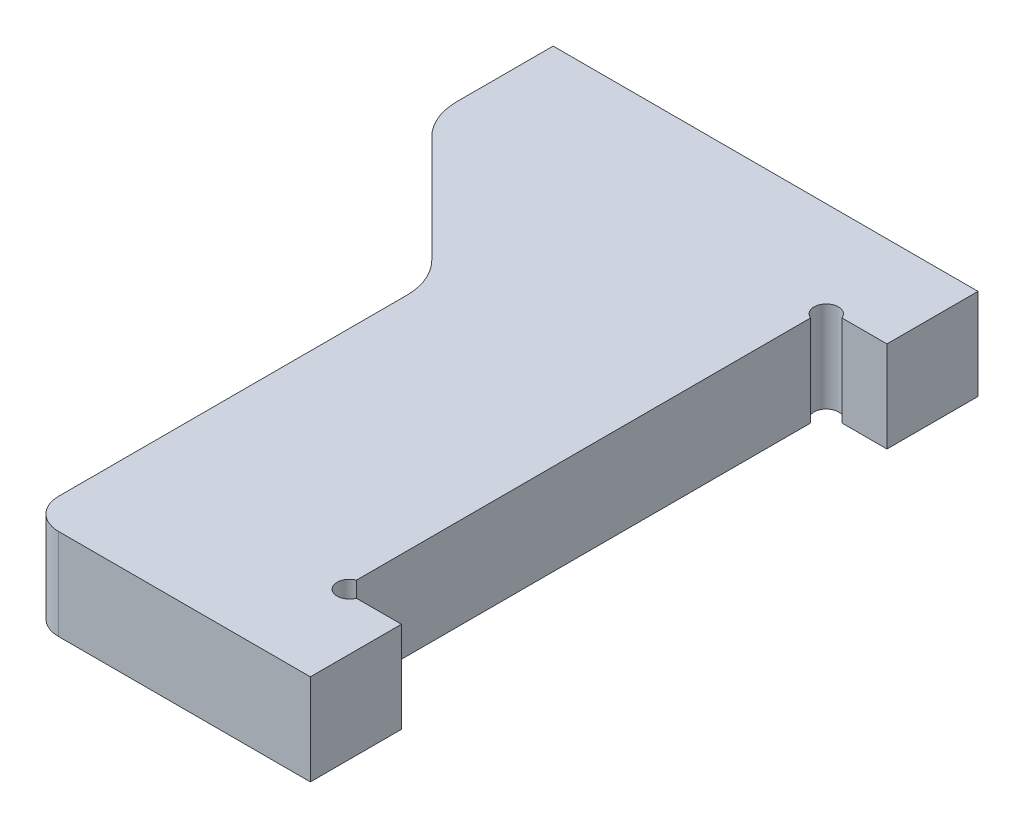
ISO-10303-21;
HEADER;
FILE_DESCRIPTION(('STEP AP214'),'2;1');
FILE_NAME('part.step','',(''),(''),'','','');
FILE_SCHEMA(('AUTOMOTIVE_DESIGN { 1 0 10303 214 1 1 1 1 }'));
ENDSEC;
DATA;
#1=APPLICATION_CONTEXT('core data for automotive mechanical design processes');
#2=APPLICATION_PROTOCOL_DEFINITION('international standard','automotive_design',2000,#1);
#3=PRODUCT_CONTEXT('',#1,'mechanical');
#4=PRODUCT('Part','Part','',(#3));
#5=PRODUCT_RELATED_PRODUCT_CATEGORY('part','',(#4));
#6=PRODUCT_DEFINITION_FORMATION('','',#4);
#7=PRODUCT_DEFINITION_CONTEXT('part definition',#1,'design');
#8=PRODUCT_DEFINITION('design','',#6,#7);
#9=PRODUCT_DEFINITION_SHAPE('','',#8);
#10=(LENGTH_UNIT() NAMED_UNIT(*) SI_UNIT(.MILLI.,.METRE.));
#11=(NAMED_UNIT(*) PLANE_ANGLE_UNIT() SI_UNIT($,.RADIAN.));
#12=(NAMED_UNIT(*) SI_UNIT($,.STERADIAN.) SOLID_ANGLE_UNIT());
#13=UNCERTAINTY_MEASURE_WITH_UNIT(LENGTH_MEASURE(1.E-05),#10,'distance_accuracy_value','');
#14=(GEOMETRIC_REPRESENTATION_CONTEXT(3) GLOBAL_UNCERTAINTY_ASSIGNED_CONTEXT((#13)) GLOBAL_UNIT_ASSIGNED_CONTEXT((#10,
#11,#12)) REPRESENTATION_CONTEXT('',''));
#15=CARTESIAN_POINT('',(0.,0.,0.));
#16=DIRECTION('',(0.,0.,1.));
#17=DIRECTION('',(1.,0.,0.));
#18=AXIS2_PLACEMENT_3D('',#15,#16,#17);
#19=CARTESIAN_POINT('',(18.25,15.,55.));
#20=DIRECTION('',(-1.,0.,0.));
#21=DIRECTION('',(0.,0.,1.));
#22=AXIS2_PLACEMENT_3D('',#19,#20,#21);
#23=PLANE('',#22);
#24=DIRECTION('',(0.,0.,-1.));
#25=VECTOR('',#24,1.);
#26=CARTESIAN_POINT('',(18.25,0.,55.));
#27=LINE('',#26,#25);
#28=CARTESIAN_POINT('',(18.25,0.,37.4220645254265));
#29=VERTEX_POINT('',#28);
#30=CARTESIAN_POINT('',(18.25,0.,-37.4220645254265));
#31=VERTEX_POINT('',#30);
#32=EDGE_CURVE('E236',#29,#31,#27,.T.);
#33=ORIENTED_EDGE('',*,*,#32,.T.);
#34=DIRECTION('',(0.,1.,0.));
#35=VECTOR('',#34,1.);
#36=CARTESIAN_POINT('',(18.25,0.,-37.4220645254265));
#37=LINE('',#36,#35);
#38=CARTESIAN_POINT('',(18.25,15.,-37.4220645254265));
#39=VERTEX_POINT('',#38);
#40=EDGE_CURVE('E181',#31,#39,#37,.T.);
#41=ORIENTED_EDGE('',*,*,#40,.T.);
#42=DIRECTION('',(0.,0.,-1.));
#43=VECTOR('',#42,1.);
#44=CARTESIAN_POINT('',(18.25,15.,55.));
#45=LINE('',#44,#43);
#46=CARTESIAN_POINT('',(18.25,15.,37.4220645254265));
#47=VERTEX_POINT('',#46);
#48=EDGE_CURVE('E165',#47,#39,#45,.T.);
#49=ORIENTED_EDGE('',*,*,#48,.F.);
#50=DIRECTION('',(0.,1.,0.));
#51=VECTOR('',#50,1.);
#52=CARTESIAN_POINT('',(18.25,0.,37.4220645254265));
#53=LINE('',#52,#51);
#54=EDGE_CURVE('E174',#47,#29,#53,.F.);
#55=ORIENTED_EDGE('',*,*,#54,.T.);
#56=EDGE_LOOP('',(#33,#41,#49,#55));
#57=FACE_BOUND('',#56,.T.);
#58=ADVANCED_FACE('F45',(#57),#23,.F.);
#59=CARTESIAN_POINT('',(-18.25,15.,55.));
#60=DIRECTION('',(1.,0.,0.));
#61=DIRECTION('',(0.,0.,-1.));
#62=AXIS2_PLACEMENT_3D('',#59,#60,#61);
#63=PLANE('',#62);
#64=DIRECTION('',(0.,0.,1.));
#65=VECTOR('',#64,1.);
#66=CARTESIAN_POINT('',(-18.25,0.,55.));
#67=LINE('',#66,#65);
#68=CARTESIAN_POINT('',(-18.25,0.,-7.35786437626913));
#69=VERTEX_POINT('',#68);
#70=CARTESIAN_POINT('',(-18.25,0.,50.));
#71=VERTEX_POINT('',#70);
#72=EDGE_CURVE('E257',#69,#71,#67,.T.);
#73=ORIENTED_EDGE('',*,*,#72,.T.);
#74=DIRECTION('',(0.,-1.,0.));
#75=VECTOR('',#74,1.);
#76=CARTESIAN_POINT('',(-18.25,15.,50.));
#77=LINE('',#76,#75);
#78=CARTESIAN_POINT('',(-18.25,15.,50.));
#79=VERTEX_POINT('',#78);
#80=EDGE_CURVE('E295',#71,#79,#77,.F.);
#81=ORIENTED_EDGE('',*,*,#80,.T.);
#82=DIRECTION('',(0.,0.,1.));
#83=VECTOR('',#82,1.);
#84=CARTESIAN_POINT('',(-18.25,15.,55.));
#85=LINE('',#84,#83);
#86=CARTESIAN_POINT('',(-18.25,15.,-7.35786437626913));
#87=VERTEX_POINT('',#86);
#88=EDGE_CURVE('E243',#87,#79,#85,.T.);
#89=ORIENTED_EDGE('',*,*,#88,.F.);
#90=DIRECTION('',(0.,1.,0.));
#91=VECTOR('',#90,1.);
#92=CARTESIAN_POINT('',(-18.25,15.,-7.35786437626913));
#93=LINE('',#92,#91);
#94=EDGE_CURVE('E279',#87,#69,#93,.F.);
#95=ORIENTED_EDGE('',*,*,#94,.T.);
#96=EDGE_LOOP('',(#73,#81,#89,#95));
#97=FACE_BOUND('',#96,.T.);
#98=ADVANCED_FACE('F316',(#97),#63,.F.);
#99=CARTESIAN_POINT('',(-18.25,15.,-55.));
#100=DIRECTION('',(0.,0.,1.));
#101=DIRECTION('',(1.,0.,0.));
#102=AXIS2_PLACEMENT_3D('',#99,#100,#101);
#103=PLANE('',#102);
#104=DIRECTION('',(-1.,0.,0.));
#105=VECTOR('',#104,1.);
#106=CARTESIAN_POINT('',(-18.25,0.,-55.));
#107=LINE('',#106,#105);
#108=CARTESIAN_POINT('',(28.25,0.,-55.));
#109=VERTEX_POINT('',#108);
#110=CARTESIAN_POINT('',(-41.75,0.,-55.));
#111=VERTEX_POINT('',#110);
#112=EDGE_CURVE('E254',#109,#111,#107,.T.);
#113=ORIENTED_EDGE('',*,*,#112,.T.);
#114=DIRECTION('',(0.,1.,0.));
#115=VECTOR('',#114,1.);
#116=CARTESIAN_POINT('',(-41.75,0.,-55.));
#117=LINE('',#116,#115);
#118=CARTESIAN_POINT('',(-41.75,15.,-55.));
#119=VERTEX_POINT('',#118);
#120=EDGE_CURVE('E226',#111,#119,#117,.T.);
#121=ORIENTED_EDGE('',*,*,#120,.T.);
#122=DIRECTION('',(-1.,0.,0.));
#123=VECTOR('',#122,1.);
#124=CARTESIAN_POINT('',(-18.25,15.,-55.));
#125=LINE('',#124,#123);
#126=CARTESIAN_POINT('',(28.25,15.,-55.));
#127=VERTEX_POINT('',#126);
#128=EDGE_CURVE('E239',#127,#119,#125,.T.);
#129=ORIENTED_EDGE('',*,*,#128,.F.);
#130=DIRECTION('',(0.,1.,0.));
#131=VECTOR('',#130,1.);
#132=CARTESIAN_POINT('',(28.25,0.,-55.));
#133=LINE('',#132,#131);
#134=EDGE_CURVE('E187',#109,#127,#133,.T.);
#135=ORIENTED_EDGE('',*,*,#134,.F.);
#136=EDGE_LOOP('',(#113,#121,#129,#135));
#137=FACE_BOUND('',#136,.T.);
#138=ADVANCED_FACE('F336',(#137),#103,.F.);
#139=CARTESIAN_POINT('',(-18.25,15.,55.));
#140=DIRECTION('',(0.,0.,-1.));
#141=DIRECTION('',(-1.,0.,0.));
#142=AXIS2_PLACEMENT_3D('',#139,#140,#141);
#143=PLANE('',#142);
#144=DIRECTION('',(1.,0.,0.));
#145=VECTOR('',#144,1.);
#146=CARTESIAN_POINT('',(-18.25,15.,55.));
#147=LINE('',#146,#145);
#148=CARTESIAN_POINT('',(-13.25,15.,55.));
#149=VERTEX_POINT('',#148);
#150=CARTESIAN_POINT('',(28.25,15.,55.));
#151=VERTEX_POINT('',#150);
#152=EDGE_CURVE('E247',#149,#151,#147,.T.);
#153=ORIENTED_EDGE('',*,*,#152,.F.);
#154=DIRECTION('',(0.,-1.,0.));
#155=VECTOR('',#154,1.);
#156=CARTESIAN_POINT('',(-13.25,15.,55.));
#157=LINE('',#156,#155);
#158=CARTESIAN_POINT('',(-13.25,0.,55.));
#159=VERTEX_POINT('',#158);
#160=EDGE_CURVE('E288',#149,#159,#157,.T.);
#161=ORIENTED_EDGE('',*,*,#160,.T.);
#162=DIRECTION('',(1.,0.,0.));
#163=VECTOR('',#162,1.);
#164=CARTESIAN_POINT('',(-18.25,0.,55.));
#165=LINE('',#164,#163);
#166=CARTESIAN_POINT('',(28.25,0.,55.));
#167=VERTEX_POINT('',#166);
#168=EDGE_CURVE('E240',#159,#167,#165,.T.);
#169=ORIENTED_EDGE('',*,*,#168,.T.);
#170=DIRECTION('',(0.,1.,0.));
#171=VECTOR('',#170,1.);
#172=CARTESIAN_POINT('',(28.25,0.,55.));
#173=LINE('',#172,#171);
#174=EDGE_CURVE('E203',#167,#151,#173,.T.);
#175=ORIENTED_EDGE('',*,*,#174,.T.);
#176=EDGE_LOOP('',(#153,#161,#169,#175));
#177=FACE_BOUND('',#176,.T.);
#178=ADVANCED_FACE('F306',(#177),#143,.F.);
#179=CARTESIAN_POINT('',(0.,15.,0.));
#180=DIRECTION('',(0.,-1.,0.));
#181=DIRECTION('',(0.,0.,-1.));
#182=AXIS2_PLACEMENT_3D('',#179,#180,#181);
#183=PLANE('',#182);
#184=ORIENTED_EDGE('',*,*,#48,.T.);
#185=CARTESIAN_POINT('',(18.9571067811865,15.,-39.2928932188134));
#186=DIRECTION('',(0.,1.,0.));
#187=DIRECTION('',(0.,0.,1.));
#188=AXIS2_PLACEMENT_3D('',#185,#186,#187);
#189=CIRCLE('',#188,2.00000000000002);
#190=CARTESIAN_POINT('',(20.8279354745735,15.,-40.));
#191=VERTEX_POINT('',#190);
#192=EDGE_CURVE('E151',#191,#39,#189,.T.);
#193=ORIENTED_EDGE('',*,*,#192,.F.);
#194=DIRECTION('',(1.,0.,0.));
#195=VECTOR('',#194,1.);
#196=CARTESIAN_POINT('',(18.25,15.,-40.));
#197=LINE('',#196,#195);
#198=CARTESIAN_POINT('',(28.25,15.,-40.));
#199=VERTEX_POINT('',#198);
#200=EDGE_CURVE('E162',#191,#199,#197,.T.);
#201=ORIENTED_EDGE('',*,*,#200,.T.);
#202=DIRECTION('',(0.,0.,-1.));
#203=VECTOR('',#202,1.);
#204=CARTESIAN_POINT('',(28.25,15.,-55.));
#205=LINE('',#204,#203);
#206=EDGE_CURVE('E173',#199,#127,#205,.T.);
#207=ORIENTED_EDGE('',*,*,#206,.T.);
#208=ORIENTED_EDGE('',*,*,#128,.T.);
#209=DIRECTION('',(0.,0.,1.));
#210=VECTOR('',#209,1.);
#211=CARTESIAN_POINT('',(-41.75,15.,-35.));
#212=LINE('',#211,#210);
#213=CARTESIAN_POINT('',(-41.75,15.,-39.142135623731));
#214=VERTEX_POINT('',#213);
#215=EDGE_CURVE('E213',#119,#214,#212,.T.);
#216=ORIENTED_EDGE('',*,*,#215,.T.);
#217=CARTESIAN_POINT('',(-31.75,15.,-39.142135623731));
#218=DIRECTION('',(0.,-1.,0.));
#219=DIRECTION('',(0.,0.,-1.));
#220=AXIS2_PLACEMENT_3D('',#217,#218,#219);
#221=CIRCLE('',#220,10.);
#222=CARTESIAN_POINT('',(-38.8210678118655,15.,-32.0710678118655));
#223=VERTEX_POINT('',#222);
#224=EDGE_CURVE('E266',#214,#223,#221,.F.);
#225=ORIENTED_EDGE('',*,*,#224,.T.);
#226=DIRECTION('',(0.707106781186549,0.,0.707106781186546));
#227=VECTOR('',#226,1.);
#228=CARTESIAN_POINT('',(-18.25,15.,-11.5000000000001));
#229=LINE('',#228,#227);
#230=CARTESIAN_POINT('',(-21.1789321881345,15.,-14.4289321881346));
#231=VERTEX_POINT('',#230);
#232=EDGE_CURVE('E222',#223,#231,#229,.T.);
#233=ORIENTED_EDGE('',*,*,#232,.T.);
#234=CARTESIAN_POINT('',(-28.25,15.,-7.35786437626914));
#235=DIRECTION('',(0.,-1.,0.));
#236=DIRECTION('',(0.,0.,-1.));
#237=AXIS2_PLACEMENT_3D('',#234,#235,#236);
#238=CIRCLE('',#237,10.);
#239=EDGE_CURVE('E282',#231,#87,#238,.T.);
#240=ORIENTED_EDGE('',*,*,#239,.T.);
#241=ORIENTED_EDGE('',*,*,#88,.T.);
#242=CARTESIAN_POINT('',(-13.25,15.,50.));
#243=DIRECTION('',(0.,-1.,0.));
#244=DIRECTION('',(0.,0.,-1.));
#245=AXIS2_PLACEMENT_3D('',#242,#243,#244);
#246=CIRCLE('',#245,5.);
#247=EDGE_CURVE('E157',#79,#149,#246,.F.);
#248=ORIENTED_EDGE('',*,*,#247,.T.);
#249=ORIENTED_EDGE('',*,*,#152,.T.);
#250=DIRECTION('',(0.,0.,-1.));
#251=VECTOR('',#250,1.);
#252=CARTESIAN_POINT('',(28.25,15.,55.));
#253=LINE('',#252,#251);
#254=CARTESIAN_POINT('',(28.25,15.,40.));
#255=VERTEX_POINT('',#254);
#256=EDGE_CURVE('E191',#151,#255,#253,.T.);
#257=ORIENTED_EDGE('',*,*,#256,.T.);
#258=DIRECTION('',(-1.,0.,0.));
#259=VECTOR('',#258,1.);
#260=CARTESIAN_POINT('',(18.25,15.,40.));
#261=LINE('',#260,#259);
#262=CARTESIAN_POINT('',(20.8279354745735,15.,40.));
#263=VERTEX_POINT('',#262);
#264=EDGE_CURVE('E199',#255,#263,#261,.T.);
#265=ORIENTED_EDGE('',*,*,#264,.T.);
#266=CARTESIAN_POINT('',(18.9571067811865,15.,39.2928932188134));
#267=DIRECTION('',(0.,1.,0.));
#268=DIRECTION('',(0.,0.,-1.));
#269=AXIS2_PLACEMENT_3D('',#266,#267,#268);
#270=CIRCLE('',#269,2.00000000000002);
#271=EDGE_CURVE('E60',#47,#263,#270,.T.);
#272=ORIENTED_EDGE('',*,*,#271,.F.);
#273=EDGE_LOOP('',(#184,#193,#201,#207,#208,#216,#225,#233,#240,#241,#248,#249,#257,#265,#272));
#274=FACE_BOUND('',#273,.T.);
#275=ADVANCED_FACE('F160',(#274),#183,.F.);
#276=CARTESIAN_POINT('',(0.,0.,0.));
#277=DIRECTION('',(0.,-1.,0.));
#278=DIRECTION('',(0.,0.,-1.));
#279=AXIS2_PLACEMENT_3D('',#276,#277,#278);
#280=PLANE('',#279);
#281=CARTESIAN_POINT('',(18.9571067811865,0.,-39.2928932188134));
#282=DIRECTION('',(0.,1.,0.));
#283=DIRECTION('',(0.,0.,1.));
#284=AXIS2_PLACEMENT_3D('',#281,#282,#283);
#285=CIRCLE('',#284,2.00000000000002);
#286=CARTESIAN_POINT('',(20.8279354745735,0.,-40.));
#287=VERTEX_POINT('',#286);
#288=EDGE_CURVE('E68',#287,#31,#285,.T.);
#289=ORIENTED_EDGE('',*,*,#288,.T.);
#290=ORIENTED_EDGE('',*,*,#32,.F.);
#291=CARTESIAN_POINT('',(18.9571067811865,0.,39.2928932188134));
#292=DIRECTION('',(0.,1.,0.));
#293=DIRECTION('',(0.,0.,-1.));
#294=AXIS2_PLACEMENT_3D('',#291,#292,#293);
#295=CIRCLE('',#294,2.00000000000002);
#296=CARTESIAN_POINT('',(20.8279354745735,0.,40.));
#297=VERTEX_POINT('',#296);
#298=EDGE_CURVE('E346',#29,#297,#295,.T.);
#299=ORIENTED_EDGE('',*,*,#298,.T.);
#300=DIRECTION('',(-1.,0.,0.));
#301=VECTOR('',#300,1.);
#302=CARTESIAN_POINT('',(18.25,0.,40.));
#303=LINE('',#302,#301);
#304=CARTESIAN_POINT('',(28.25,0.,40.));
#305=VERTEX_POINT('',#304);
#306=EDGE_CURVE('E198',#305,#297,#303,.T.);
#307=ORIENTED_EDGE('',*,*,#306,.F.);
#308=DIRECTION('',(0.,0.,-1.));
#309=VECTOR('',#308,1.);
#310=CARTESIAN_POINT('',(28.25,0.,55.));
#311=LINE('',#310,#309);
#312=EDGE_CURVE('E194',#167,#305,#311,.T.);
#313=ORIENTED_EDGE('',*,*,#312,.F.);
#314=ORIENTED_EDGE('',*,*,#168,.F.);
#315=CARTESIAN_POINT('',(-13.25,0.,50.));
#316=DIRECTION('',(0.,-1.,0.));
#317=DIRECTION('',(0.,0.,-1.));
#318=AXIS2_PLACEMENT_3D('',#315,#316,#317);
#319=CIRCLE('',#318,5.);
#320=EDGE_CURVE('E292',#159,#71,#319,.T.);
#321=ORIENTED_EDGE('',*,*,#320,.T.);
#322=ORIENTED_EDGE('',*,*,#72,.F.);
#323=CARTESIAN_POINT('',(-28.25,0.,-7.35786437626914));
#324=DIRECTION('',(0.,-1.,0.));
#325=DIRECTION('',(0.,0.,-1.));
#326=AXIS2_PLACEMENT_3D('',#323,#324,#325);
#327=CIRCLE('',#326,10.);
#328=CARTESIAN_POINT('',(-21.1789321881345,0.,-14.4289321881346));
#329=VERTEX_POINT('',#328);
#330=EDGE_CURVE('E285',#69,#329,#327,.F.);
#331=ORIENTED_EDGE('',*,*,#330,.T.);
#332=DIRECTION('',(0.707106781186549,0.,0.707106781186546));
#333=VECTOR('',#332,1.);
#334=CARTESIAN_POINT('',(-18.25,0.,-11.5000000000001));
#335=LINE('',#334,#333);
#336=CARTESIAN_POINT('',(-38.8210678118655,0.,-32.0710678118655));
#337=VERTEX_POINT('',#336);
#338=EDGE_CURVE('E221',#337,#329,#335,.T.);
#339=ORIENTED_EDGE('',*,*,#338,.F.);
#340=CARTESIAN_POINT('',(-31.75,0.,-39.142135623731));
#341=DIRECTION('',(0.,-1.,0.));
#342=DIRECTION('',(0.,0.,-1.));
#343=AXIS2_PLACEMENT_3D('',#340,#341,#342);
#344=CIRCLE('',#343,10.);
#345=CARTESIAN_POINT('',(-41.75,0.,-39.142135623731));
#346=VERTEX_POINT('',#345);
#347=EDGE_CURVE('E276',#337,#346,#344,.T.);
#348=ORIENTED_EDGE('',*,*,#347,.T.);
#349=DIRECTION('',(0.,0.,1.));
#350=VECTOR('',#349,1.);
#351=CARTESIAN_POINT('',(-41.75,0.,-35.));
#352=LINE('',#351,#350);
#353=EDGE_CURVE('E217',#111,#346,#352,.T.);
#354=ORIENTED_EDGE('',*,*,#353,.F.);
#355=ORIENTED_EDGE('',*,*,#112,.F.);
#356=DIRECTION('',(0.,0.,-1.));
#357=VECTOR('',#356,1.);
#358=CARTESIAN_POINT('',(28.25,0.,-55.));
#359=LINE('',#358,#357);
#360=CARTESIAN_POINT('',(28.25,0.,-40.));
#361=VERTEX_POINT('',#360);
#362=EDGE_CURVE('E184',#361,#109,#359,.T.);
#363=ORIENTED_EDGE('',*,*,#362,.F.);
#364=DIRECTION('',(1.,0.,0.));
#365=VECTOR('',#364,1.);
#366=CARTESIAN_POINT('',(18.25,0.,-40.));
#367=LINE('',#366,#365);
#368=EDGE_CURVE('E178',#287,#361,#367,.T.);
#369=ORIENTED_EDGE('',*,*,#368,.F.);
#370=EDGE_LOOP('',(#289,#290,#299,#307,#313,#314,#321,#322,#331,#339,#348,#354,#355,#363,#369));
#371=FACE_BOUND('',#370,.T.);
#372=ADVANCED_FACE('F312',(#371),#280,.T.);
#373=CARTESIAN_POINT('',(-18.25,0.,-11.5000000000001));
#374=DIRECTION('',(-0.707106781186546,0.,0.707106781186549));
#375=DIRECTION('',(0.707106781186549,0.,0.707106781186546));
#376=AXIS2_PLACEMENT_3D('',#373,#374,#375);
#377=PLANE('',#376);
#378=ORIENTED_EDGE('',*,*,#232,.F.);
#379=DIRECTION('',(0.,1.,0.));
#380=VECTOR('',#379,1.);
#381=CARTESIAN_POINT('',(-38.8210678118655,0.,-32.0710678118655));
#382=LINE('',#381,#380);
#383=EDGE_CURVE('E273',#223,#337,#382,.F.);
#384=ORIENTED_EDGE('',*,*,#383,.T.);
#385=ORIENTED_EDGE('',*,*,#338,.T.);
#386=DIRECTION('',(0.,1.,0.));
#387=VECTOR('',#386,1.);
#388=CARTESIAN_POINT('',(-21.1789321881345,0.,-14.4289321881346));
#389=LINE('',#388,#387);
#390=EDGE_CURVE('E269',#329,#231,#389,.T.);
#391=ORIENTED_EDGE('',*,*,#390,.T.);
#392=EDGE_LOOP('',(#378,#384,#385,#391));
#393=FACE_BOUND('',#392,.T.);
#394=ADVANCED_FACE('F325',(#393),#377,.T.);
#395=CARTESIAN_POINT('',(-41.75,0.,-35.));
#396=DIRECTION('',(-1.,0.,0.));
#397=DIRECTION('',(0.,0.,1.));
#398=AXIS2_PLACEMENT_3D('',#395,#396,#397);
#399=PLANE('',#398);
#400=ORIENTED_EDGE('',*,*,#353,.T.);
#401=DIRECTION('',(0.,1.,0.));
#402=VECTOR('',#401,1.);
#403=CARTESIAN_POINT('',(-41.75,0.,-39.142135623731));
#404=LINE('',#403,#402);
#405=EDGE_CURVE('E250',#346,#214,#404,.T.);
#406=ORIENTED_EDGE('',*,*,#405,.T.);
#407=ORIENTED_EDGE('',*,*,#215,.F.);
#408=ORIENTED_EDGE('',*,*,#120,.F.);
#409=EDGE_LOOP('',(#400,#406,#407,#408));
#410=FACE_BOUND('',#409,.T.);
#411=ADVANCED_FACE('F333',(#410),#399,.T.);
#412=CARTESIAN_POINT('',(-31.75,0.,-39.142135623731));
#413=DIRECTION('',(0.,1.,0.));
#414=DIRECTION('',(0.,0.,1.));
#415=AXIS2_PLACEMENT_3D('',#412,#413,#414);
#416=CYLINDRICAL_SURFACE('',#415,10.);
#417=ORIENTED_EDGE('',*,*,#347,.F.);
#418=ORIENTED_EDGE('',*,*,#383,.F.);
#419=ORIENTED_EDGE('',*,*,#224,.F.);
#420=ORIENTED_EDGE('',*,*,#405,.F.);
#421=EDGE_LOOP('',(#417,#418,#419,#420));
#422=FACE_BOUND('',#421,.T.);
#423=ADVANCED_FACE('F328',(#422),#416,.T.);
#424=CARTESIAN_POINT('',(-28.25,0.,-7.35786437626914));
#425=DIRECTION('',(0.,1.,0.));
#426=DIRECTION('',(0.,0.,1.));
#427=AXIS2_PLACEMENT_3D('',#424,#425,#426);
#428=CYLINDRICAL_SURFACE('',#427,10.);
#429=ORIENTED_EDGE('',*,*,#330,.F.);
#430=ORIENTED_EDGE('',*,*,#94,.F.);
#431=ORIENTED_EDGE('',*,*,#239,.F.);
#432=ORIENTED_EDGE('',*,*,#390,.F.);
#433=EDGE_LOOP('',(#429,#430,#431,#432));
#434=FACE_BOUND('',#433,.T.);
#435=ADVANCED_FACE('F319',(#434),#428,.F.);
#436=CARTESIAN_POINT('',(-13.25,15.,50.));
#437=DIRECTION('',(0.,-1.,0.));
#438=DIRECTION('',(0.,0.,-1.));
#439=AXIS2_PLACEMENT_3D('',#436,#437,#438);
#440=CYLINDRICAL_SURFACE('',#439,5.);
#441=ORIENTED_EDGE('',*,*,#247,.F.);
#442=ORIENTED_EDGE('',*,*,#80,.F.);
#443=ORIENTED_EDGE('',*,*,#320,.F.);
#444=ORIENTED_EDGE('',*,*,#160,.F.);
#445=EDGE_LOOP('',(#441,#442,#443,#444));
#446=FACE_BOUND('',#445,.T.);
#447=ADVANCED_FACE('F47',(#446),#440,.T.);
#448=CARTESIAN_POINT('',(18.25,0.,40.));
#449=DIRECTION('',(0.,0.,-1.));
#450=DIRECTION('',(-1.,0.,0.));
#451=AXIS2_PLACEMENT_3D('',#448,#449,#450);
#452=PLANE('',#451);
#453=DIRECTION('',(0.,1.,0.));
#454=VECTOR('',#453,1.);
#455=CARTESIAN_POINT('',(20.8279354745735,0.,40.));
#456=LINE('',#455,#454);
#457=EDGE_CURVE('E11',#263,#297,#456,.F.);
#458=ORIENTED_EDGE('',*,*,#457,.F.);
#459=ORIENTED_EDGE('',*,*,#264,.F.);
#460=DIRECTION('',(0.,1.,0.));
#461=VECTOR('',#460,1.);
#462=CARTESIAN_POINT('',(28.25,0.,40.));
#463=LINE('',#462,#461);
#464=EDGE_CURVE('E210',#305,#255,#463,.T.);
#465=ORIENTED_EDGE('',*,*,#464,.F.);
#466=ORIENTED_EDGE('',*,*,#306,.T.);
#467=EDGE_LOOP('',(#458,#459,#465,#466));
#468=FACE_BOUND('',#467,.T.);
#469=ADVANCED_FACE('F358',(#468),#452,.T.);
#470=CARTESIAN_POINT('',(28.25,0.,55.));
#471=DIRECTION('',(1.,0.,0.));
#472=DIRECTION('',(0.,0.,-1.));
#473=AXIS2_PLACEMENT_3D('',#470,#471,#472);
#474=PLANE('',#473);
#475=ORIENTED_EDGE('',*,*,#256,.F.);
#476=ORIENTED_EDGE('',*,*,#174,.F.);
#477=ORIENTED_EDGE('',*,*,#312,.T.);
#478=ORIENTED_EDGE('',*,*,#464,.T.);
#479=EDGE_LOOP('',(#475,#476,#477,#478));
#480=FACE_BOUND('',#479,.T.);
#481=ADVANCED_FACE('F361',(#480),#474,.T.);
#482=CARTESIAN_POINT('',(28.25,0.,-55.));
#483=DIRECTION('',(1.,0.,0.));
#484=DIRECTION('',(0.,0.,-1.));
#485=AXIS2_PLACEMENT_3D('',#482,#483,#484);
#486=PLANE('',#485);
#487=ORIENTED_EDGE('',*,*,#206,.F.);
#488=DIRECTION('',(0.,1.,0.));
#489=VECTOR('',#488,1.);
#490=CARTESIAN_POINT('',(28.25,0.,-40.));
#491=LINE('',#490,#489);
#492=EDGE_CURVE('E170',#361,#199,#491,.T.);
#493=ORIENTED_EDGE('',*,*,#492,.F.);
#494=ORIENTED_EDGE('',*,*,#362,.T.);
#495=ORIENTED_EDGE('',*,*,#134,.T.);
#496=EDGE_LOOP('',(#487,#493,#494,#495));
#497=FACE_BOUND('',#496,.T.);
#498=ADVANCED_FACE('F363',(#497),#486,.T.);
#499=CARTESIAN_POINT('',(18.25,0.,-40.));
#500=DIRECTION('',(0.,0.,1.));
#501=DIRECTION('',(1.,0.,0.));
#502=AXIS2_PLACEMENT_3D('',#499,#500,#501);
#503=PLANE('',#502);
#504=DIRECTION('',(0.,1.,0.));
#505=VECTOR('',#504,1.);
#506=CARTESIAN_POINT('',(20.8279354745735,0.,-40.));
#507=LINE('',#506,#505);
#508=EDGE_CURVE('E54',#287,#191,#507,.T.);
#509=ORIENTED_EDGE('',*,*,#508,.F.);
#510=ORIENTED_EDGE('',*,*,#368,.T.);
#511=ORIENTED_EDGE('',*,*,#492,.T.);
#512=ORIENTED_EDGE('',*,*,#200,.F.);
#513=EDGE_LOOP('',(#509,#510,#511,#512));
#514=FACE_BOUND('',#513,.T.);
#515=ADVANCED_FACE('F168',(#514),#503,.T.);
#516=CARTESIAN_POINT('',(18.9571067811865,0.,-39.2928932188134));
#517=DIRECTION('',(0.,1.,0.));
#518=DIRECTION('',(0.,0.,1.));
#519=AXIS2_PLACEMENT_3D('',#516,#517,#518);
#520=CYLINDRICAL_SURFACE('',#519,2.00000000000002);
#521=ORIENTED_EDGE('',*,*,#288,.F.);
#522=ORIENTED_EDGE('',*,*,#508,.T.);
#523=ORIENTED_EDGE('',*,*,#192,.T.);
#524=ORIENTED_EDGE('',*,*,#40,.F.);
#525=EDGE_LOOP('',(#521,#522,#523,#524));
#526=FACE_BOUND('',#525,.T.);
#527=ADVANCED_FACE('F150',(#526),#520,.F.);
#528=CARTESIAN_POINT('',(18.9571067811865,0.,39.2928932188134));
#529=DIRECTION('',(0.,1.,0.));
#530=DIRECTION('',(0.,0.,1.));
#531=AXIS2_PLACEMENT_3D('',#528,#529,#530);
#532=CYLINDRICAL_SURFACE('',#531,2.00000000000002);
#533=ORIENTED_EDGE('',*,*,#271,.T.);
#534=ORIENTED_EDGE('',*,*,#457,.T.);
#535=ORIENTED_EDGE('',*,*,#298,.F.);
#536=ORIENTED_EDGE('',*,*,#54,.F.);
#537=EDGE_LOOP('',(#533,#534,#535,#536));
#538=FACE_BOUND('',#537,.T.);
#539=ADVANCED_FACE('F355',(#538),#532,.F.);
#540=CLOSED_SHELL('',(#58,#98,#138,#178,#275,#372,#394,#411,#423,#435,#447,#469,#481,#498,#515,
#527,#539));
#541=MANIFOLD_SOLID_BREP('B2',#540);
#542=ADVANCED_BREP_SHAPE_REPRESENTATION('',(#18,#541),#14);
#543=SHAPE_DEFINITION_REPRESENTATION(#9,#542);
ENDSEC;
END-ISO-10303-21;
